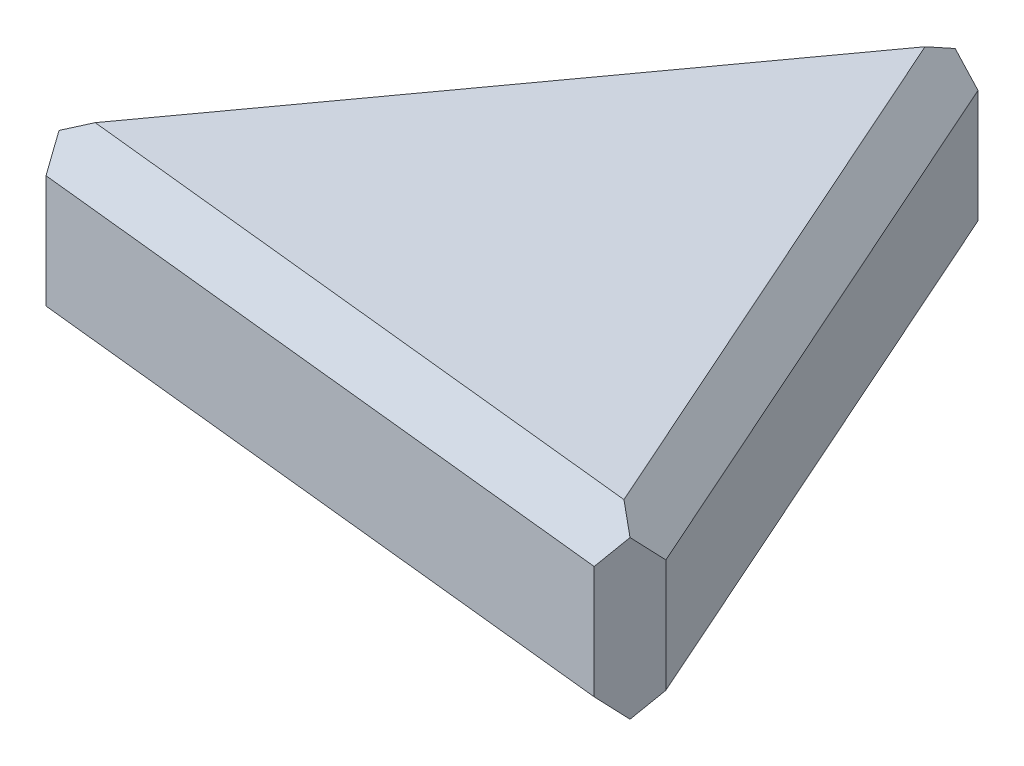
ISO-10303-21;
HEADER;
FILE_DESCRIPTION(('STEP AP214'),'2;1');
FILE_NAME('part.step','',(''),(''),'','','');
FILE_SCHEMA(('AUTOMOTIVE_DESIGN { 1 0 10303 214 1 1 1 1 }'));
ENDSEC;
DATA;
#1=APPLICATION_CONTEXT('core data for automotive mechanical design processes');
#2=APPLICATION_PROTOCOL_DEFINITION('international standard','automotive_design',2000,#1);
#3=PRODUCT_CONTEXT('',#1,'mechanical');
#4=PRODUCT('Part','Part','',(#3));
#5=PRODUCT_RELATED_PRODUCT_CATEGORY('part','',(#4));
#6=PRODUCT_DEFINITION_FORMATION('','',#4);
#7=PRODUCT_DEFINITION_CONTEXT('part definition',#1,'design');
#8=PRODUCT_DEFINITION('design','',#6,#7);
#9=PRODUCT_DEFINITION_SHAPE('','',#8);
#10=(LENGTH_UNIT() NAMED_UNIT(*) SI_UNIT(.MILLI.,.METRE.));
#11=(NAMED_UNIT(*) PLANE_ANGLE_UNIT() SI_UNIT($,.RADIAN.));
#12=(NAMED_UNIT(*) SI_UNIT($,.STERADIAN.) SOLID_ANGLE_UNIT());
#13=UNCERTAINTY_MEASURE_WITH_UNIT(LENGTH_MEASURE(1.E-05),#10,'distance_accuracy_value','');
#14=(GEOMETRIC_REPRESENTATION_CONTEXT(3) GLOBAL_UNCERTAINTY_ASSIGNED_CONTEXT((#13)) GLOBAL_UNIT_ASSIGNED_CONTEXT((#10,
#11,#12)) REPRESENTATION_CONTEXT('',''));
#15=CARTESIAN_POINT('',(0.,0.,0.));
#16=DIRECTION('',(0.,0.,1.));
#17=DIRECTION('',(1.,0.,0.));
#18=AXIS2_PLACEMENT_3D('',#15,#16,#17);
#19=CARTESIAN_POINT('',(-95.9799388681262,36.,20.608061996772));
#20=DIRECTION('',(0.104497998360099,0.,-0.99452509688732));
#21=DIRECTION('',(-0.99452509688732,0.,-0.104497998360099));
#22=AXIS2_PLACEMENT_3D('',#19,#20,#21);
#23=PLANE('',#22);
#24=DIRECTION('',(0.99452509688732,0.,0.104497998360099));
#25=VECTOR('',#24,1.);
#26=CARTESIAN_POINT('',(-95.9799388681262,6.99999999999998,20.608061996772));
#27=LINE('',#26,#25);
#28=CARTESIAN_POINT('',(-86.034687899253,6.99999999999998,21.653041980373));
#29=VERTEX_POINT('',#28);
#30=CARTESIAN_POINT('',(33.3083237272255,6.99999999999998,34.1928017835849));
#31=VERTEX_POINT('',#30);
#32=EDGE_CURVE('E158',#29,#31,#27,.T.);
#33=ORIENTED_EDGE('',*,*,#32,.T.);
#34=DIRECTION('',(0.,1.,0.));
#35=VECTOR('',#34,1.);
#36=CARTESIAN_POINT('',(33.3083237272255,36.,34.1928017835849));
#37=LINE('',#36,#35);
#38=CARTESIAN_POINT('',(33.3083237272255,29.,34.1928017835849));
#39=VERTEX_POINT('',#38);
#40=EDGE_CURVE('E197',#31,#39,#37,.T.);
#41=ORIENTED_EDGE('',*,*,#40,.T.);
#42=DIRECTION('',(-0.99452509688732,0.,-0.104497998360099));
#43=VECTOR('',#42,1.);
#44=CARTESIAN_POINT('',(-95.9799388681262,29.,20.608061996772));
#45=LINE('',#44,#43);
#46=CARTESIAN_POINT('',(-86.034687899253,29.,21.653041980373));
#47=VERTEX_POINT('',#46);
#48=EDGE_CURVE('E155',#39,#47,#45,.T.);
#49=ORIENTED_EDGE('',*,*,#48,.T.);
#50=DIRECTION('',(0.,-1.,0.));
#51=VECTOR('',#50,1.);
#52=CARTESIAN_POINT('',(-86.034687899253,36.,21.653041980373));
#53=LINE('',#52,#51);
#54=EDGE_CURVE('E194',#47,#29,#53,.T.);
#55=ORIENTED_EDGE('',*,*,#54,.T.);
#56=EDGE_LOOP('',(#33,#41,#49,#55));
#57=FACE_BOUND('',#56,.T.);
#58=ADVANCED_FACE('F34',(#57),#23,.F.);
#59=CARTESIAN_POINT('',(43.2535746960987,36.,35.2377817671859));
#60=DIRECTION('',(-0.913532997785649,0.,0.406764627219189));
#61=DIRECTION('',(0.406764627219189,0.,0.913532997785649));
#62=AXIS2_PLACEMENT_3D('',#59,#60,#61);
#63=PLANE('',#62);
#64=DIRECTION('',(0.406764627219189,0.,0.913532997785649));
#65=VECTOR('',#64,1.);
#66=CARTESIAN_POINT('',(43.2535746960987,29.,35.2377817671859));
#67=LINE('',#66,#65);
#68=CARTESIAN_POINT('',(-9.6258268423959,29.,-83.5215079449484));
#69=VERTEX_POINT('',#68);
#70=CARTESIAN_POINT('',(39.1859284239068,29.,26.1024517893295));
#71=VERTEX_POINT('',#70);
#72=EDGE_CURVE('E140',#69,#71,#67,.T.);
#73=ORIENTED_EDGE('',*,*,#72,.T.);
#74=DIRECTION('',(0.,-1.,0.));
#75=VECTOR('',#74,1.);
#76=CARTESIAN_POINT('',(39.1859284239068,36.,26.1024517893295));
#77=LINE('',#76,#75);
#78=CARTESIAN_POINT('',(39.1859284239068,6.99999999999999,26.1024517893295));
#79=VERTEX_POINT('',#78);
#80=EDGE_CURVE('E184',#71,#79,#77,.T.);
#81=ORIENTED_EDGE('',*,*,#80,.T.);
#82=DIRECTION('',(-0.406764627219189,0.,-0.913532997785649));
#83=VECTOR('',#82,1.);
#84=CARTESIAN_POINT('',(43.2535746960987,7.,35.2377817671859));
#85=LINE('',#84,#83);
#86=CARTESIAN_POINT('',(-9.62582684239593,7.,-83.5215079449485));
#87=VERTEX_POINT('',#86);
#88=EDGE_CURVE('E148',#79,#87,#85,.T.);
#89=ORIENTED_EDGE('',*,*,#88,.T.);
#90=DIRECTION('',(0.,1.,0.));
#91=VECTOR('',#90,1.);
#92=CARTESIAN_POINT('',(-9.6258268423959,36.,-83.5215079449484));
#93=LINE('',#92,#91);
#94=EDGE_CURVE('E173',#87,#69,#93,.T.);
#95=ORIENTED_EDGE('',*,*,#94,.T.);
#96=EDGE_LOOP('',(#73,#81,#89,#95));
#97=FACE_BOUND('',#96,.T.);
#98=ADVANCED_FACE('F241',(#97),#63,.F.);
#99=CARTESIAN_POINT('',(-13.6934731145878,36.,-92.6568379228049));
#100=DIRECTION('',(0.809034999425549,0.,0.587760469668131));
#101=DIRECTION('',(0.587760469668131,0.,-0.809034999425549));
#102=AXIS2_PLACEMENT_3D('',#99,#100,#101);
#103=PLANE('',#102);
#104=DIRECTION('',(0.587760469668131,0.,-0.809034999425549));
#105=VECTOR('',#104,1.);
#106=CARTESIAN_POINT('',(-13.6934731145878,29.,-92.6568379228049));
#107=LINE('',#106,#105);
#108=CARTESIAN_POINT('',(-90.1023341714449,29.,12.5177120025166));
#109=VERTEX_POINT('',#108);
#110=CARTESIAN_POINT('',(-19.5710778112691,29.,-84.5664879285494));
#111=VERTEX_POINT('',#110);
#112=EDGE_CURVE('E161',#109,#111,#107,.T.);
#113=ORIENTED_EDGE('',*,*,#112,.T.);
#114=DIRECTION('',(0.,-1.,0.));
#115=VECTOR('',#114,1.);
#116=CARTESIAN_POINT('',(-19.5710778112691,36.,-84.5664879285494));
#117=LINE('',#116,#115);
#118=CARTESIAN_POINT('',(-19.5710778112691,6.99999999999999,-84.5664879285494));
#119=VERTEX_POINT('',#118);
#120=EDGE_CURVE('E208',#111,#119,#117,.T.);
#121=ORIENTED_EDGE('',*,*,#120,.T.);
#122=DIRECTION('',(-0.587760469668131,0.,0.809034999425549));
#123=VECTOR('',#122,1.);
#124=CARTESIAN_POINT('',(-13.6934731145878,7.,-92.6568379228049));
#125=LINE('',#124,#123);
#126=CARTESIAN_POINT('',(-90.1023341714449,7.,12.5177120025166));
#127=VERTEX_POINT('',#126);
#128=EDGE_CURVE('E163',#119,#127,#125,.T.);
#129=ORIENTED_EDGE('',*,*,#128,.T.);
#130=DIRECTION('',(0.,1.,0.));
#131=VECTOR('',#130,1.);
#132=CARTESIAN_POINT('',(-90.1023341714449,36.,12.5177120025166));
#133=LINE('',#132,#131);
#134=EDGE_CURVE('E54',#127,#109,#133,.T.);
#135=ORIENTED_EDGE('',*,*,#134,.T.);
#136=EDGE_LOOP('',(#113,#121,#129,#135));
#137=FACE_BOUND('',#136,.T.);
#138=ADVANCED_FACE('F250',(#137),#103,.F.);
#139=CARTESIAN_POINT('',(0.,36.,0.));
#140=DIRECTION('',(0.,1.,0.));
#141=DIRECTION('',(0.,0.,1.));
#142=AXIS2_PLACEMENT_3D('',#139,#140,#141);
#143=PLANE('',#142);
#144=DIRECTION('',(-0.587760469668131,0.,0.809034999425549));
#145=VECTOR('',#144,1.);
#146=CARTESIAN_POINT('',(-90.3166938721473,36.,24.7223852844489));
#147=LINE('',#146,#145);
#148=CARTESIAN_POINT('',(-15.1564450916292,36.,-78.7334865663825));
#149=VERTEX_POINT('',#148);
#150=CARTESIAN_POINT('',(-83.1904768991271,36.,14.9133572157034));
#151=VERTEX_POINT('',#150);
#152=EDGE_CURVE('E165',#149,#151,#147,.T.);
#153=ORIENTED_EDGE('',*,*,#152,.T.);
#154=DIRECTION('',(0.99452509688732,0.,0.104497998360099));
#155=VECTOR('',#154,1.);
#156=CARTESIAN_POINT('',(43.9850606846194,36.,28.2761060889747));
#157=LINE('',#156,#155);
#158=CARTESIAN_POINT('',(31.927084704141,36.,27.0091351918321));
#159=VERTEX_POINT('',#158);
#160=EDGE_CURVE('E170',#151,#159,#157,.T.);
#161=ORIENTED_EDGE('',*,*,#160,.T.);
#162=DIRECTION('',(-0.406764627219189,0.,-0.913532997785649));
#163=VECTOR('',#162,1.);
#164=CARTESIAN_POINT('',(-20.0882040990873,36.,-89.8094855322706));
#165=LINE('',#164,#163);
#166=EDGE_CURVE('E167',#159,#149,#165,.T.);
#167=ORIENTED_EDGE('',*,*,#166,.T.);
#168=EDGE_LOOP('',(#153,#161,#167));
#169=FACE_BOUND('',#168,.T.);
#170=ADVANCED_FACE('F252',(#169),#143,.T.);
#171=CARTESIAN_POINT('',(0.,0.,0.));
#172=DIRECTION('',(0.,1.,0.));
#173=DIRECTION('',(0.,0.,1.));
#174=AXIS2_PLACEMENT_3D('',#171,#172,#173);
#175=PLANE('',#174);
#176=DIRECTION('',(0.587760469668131,0.,-0.809034999425549));
#177=VECTOR('',#176,1.);
#178=CARTESIAN_POINT('',(-47.3597160161607,0.,-34.4066312937918));
#179=LINE('',#178,#177);
#180=CARTESIAN_POINT('',(-83.1904768991271,0.,14.9133572157034));
#181=VERTEX_POINT('',#180);
#182=CARTESIAN_POINT('',(-15.1564450916292,0.,-78.7334865663824));
#183=VERTEX_POINT('',#182);
#184=EDGE_CURVE('E127',#181,#183,#179,.T.);
#185=ORIENTED_EDGE('',*,*,#184,.T.);
#186=DIRECTION('',(0.406764627219189,0.,0.913532997785649));
#187=VECTOR('',#186,1.);
#188=CARTESIAN_POINT('',(16.6081071777941,0.,-7.39501533208645));
#189=LINE('',#188,#187);
#190=CARTESIAN_POINT('',(31.9270847041409,0.,27.0091351918321));
#191=VERTEX_POINT('',#190);
#192=EDGE_CURVE('E129',#183,#191,#189,.T.);
#193=ORIENTED_EDGE('',*,*,#192,.T.);
#194=DIRECTION('',(-0.99452509688732,0.,-0.104497998360099));
#195=VECTOR('',#194,1.);
#196=CARTESIAN_POINT('',(-2.45830980494107,0.,23.3961495464547));
#197=LINE('',#196,#195);
#198=EDGE_CURVE('E123',#191,#181,#197,.T.);
#199=ORIENTED_EDGE('',*,*,#198,.T.);
#200=EDGE_LOOP('',(#185,#193,#199));
#201=FACE_BOUND('',#200,.T.);
#202=ADVANCED_FACE('F125',(#201),#175,.F.);
#203=CARTESIAN_POINT('',(-95.9799388681262,6.99999999999998,20.608061996772));
#204=DIRECTION('',(0.0738912432608467,0.70710678118655,-0.70323544006923));
#205=DIRECTION('',(0.99452509688732,0.,0.104497998360099));
#206=AXIS2_PLACEMENT_3D('',#203,#204,#205);
#207=PLANE('',#206);
#208=DIRECTION('',(0.723622901956814,0.447213595499956,0.525708945866058));
#209=VECTOR('',#208,1.);
#210=CARTESIAN_POINT('',(-35.2186498538661,-41.4974226119285,-21.7719540169761));
#211=LINE('',#210,#209);
#212=CARTESIAN_POINT('',(36.2471260755661,2.66987298107779,30.1476267864572));
#213=VERTEX_POINT('',#212);
#214=EDGE_CURVE('E141',#213,#191,#211,.F.);
#215=ORIENTED_EDGE('',*,*,#214,.F.);
#216=DIRECTION('',(-0.444305152347543,0.654653670707975,0.611572974407798));
#217=VECTOR('',#216,1.);
#218=CARTESIAN_POINT('',(11.4772205681234,39.1666578548506,64.2426731908198));
#219=LINE('',#218,#217);
#220=EDGE_CURVE('E192',#213,#31,#219,.T.);
#221=ORIENTED_EDGE('',*,*,#220,.T.);
#222=ORIENTED_EDGE('',*,*,#32,.F.);
#223=DIRECTION('',(-0.307485155931391,-0.654653670707975,-0.690566036169186));
#224=VECTOR('',#223,1.);
#225=CARTESIAN_POINT('',(-87.1968725484507,4.52564170347303,19.0429477009854));
#226=LINE('',#225,#224);
#227=CARTESIAN_POINT('',(-88.068511035349,2.66987298107783,17.0853769914448));
#228=VERTEX_POINT('',#227);
#229=EDGE_CURVE('E137',#29,#228,#226,.T.);
#230=ORIENTED_EDGE('',*,*,#229,.T.);
#231=DIRECTION('',(-0.817088753095151,0.447213595499956,0.363821342921788));
#232=VECTOR('',#231,1.);
#233=CARTESIAN_POINT('',(-7.37194714102068,-41.4974226119285,-18.8460100628933));
#234=LINE('',#233,#232);
#235=EDGE_CURVE('E134',#181,#228,#234,.T.);
#236=ORIENTED_EDGE('',*,*,#235,.F.);
#237=ORIENTED_EDGE('',*,*,#198,.F.);
#238=EDGE_LOOP('',(#215,#221,#222,#230,#236,#237));
#239=FACE_BOUND('',#238,.T.);
#240=ADVANCED_FACE('F135',(#239),#207,.F.);
#241=CARTESIAN_POINT('',(-13.6934731145878,6.99999999999998,-92.6568379228049));
#242=DIRECTION('',(0.572074134311059,0.707106781186549,0.415609413815725));
#243=DIRECTION('',(-0.587760469668131,0.,0.809034999425549));
#244=AXIS2_PLACEMENT_3D('',#241,#242,#243);
#245=PLANE('',#244);
#246=ORIENTED_EDGE('',*,*,#128,.F.);
#247=DIRECTION('',(0.751790308278934,-0.654653670707976,0.0789930617613894));
#248=VECTOR('',#247,1.);
#249=CARTESIAN_POINT('',(-16.7295775344482,4.52564170347302,-84.2679222189492));
#250=LINE('',#249,#248);
#251=CARTESIAN_POINT('',(-14.5984523268325,2.66987298107781,-84.0439979367489));
#252=VERTEX_POINT('',#251);
#253=EDGE_CURVE('E213',#119,#252,#250,.T.);
#254=ORIENTED_EDGE('',*,*,#253,.T.);
#255=DIRECTION('',(-0.0934658511383387,-0.447213595499956,0.889530288787845));
#256=VECTOR('',#255,1.);
#257=CARTESIAN_POINT('',(-13.6934731145878,6.99999999999998,-92.6568379228049));
#258=LINE('',#257,#256);
#259=EDGE_CURVE('E147',#183,#252,#258,.F.);
#260=ORIENTED_EDGE('',*,*,#259,.F.);
#261=ORIENTED_EDGE('',*,*,#184,.F.);
#262=ORIENTED_EDGE('',*,*,#235,.T.);
#263=DIRECTION('',(-0.307485155931391,0.654653670707976,-0.690566036169186));
#264=VECTOR('',#263,1.);
#265=CARTESIAN_POINT('',(-105.210734611015,39.1666578548506,-21.413513629522));
#266=LINE('',#265,#264);
#267=EDGE_CURVE('E211',#228,#127,#266,.T.);
#268=ORIENTED_EDGE('',*,*,#267,.T.);
#269=EDGE_LOOP('',(#246,#254,#260,#261,#262,#268));
#270=FACE_BOUND('',#269,.T.);
#271=ADVANCED_FACE('F145',(#270),#245,.F.);
#272=CARTESIAN_POINT('',(43.2535746960987,6.99999999999998,35.2377817671859));
#273=DIRECTION('',(-0.645965377571906,0.70710678118655,0.287626026253506));
#274=DIRECTION('',(-0.406764627219189,0.,-0.913532997785649));
#275=AXIS2_PLACEMENT_3D('',#272,#273,#274);
#276=PLANE('',#275);
#277=ORIENTED_EDGE('',*,*,#88,.F.);
#278=DIRECTION('',(-0.444305152347543,-0.654653670707975,0.611572974407798));
#279=VECTOR('',#278,1.);
#280=CARTESIAN_POINT('',(37.5066127962835,4.52564170347302,28.4139803591168));
#281=LINE('',#280,#279);
#282=EDGE_CURVE('E189',#79,#213,#281,.T.);
#283=ORIENTED_EDGE('',*,*,#282,.T.);
#284=ORIENTED_EDGE('',*,*,#214,.T.);
#285=ORIENTED_EDGE('',*,*,#192,.F.);
#286=ORIENTED_EDGE('',*,*,#259,.T.);
#287=DIRECTION('',(0.751790308278935,0.654653670707975,0.0789930617613895));
#288=VECTOR('',#287,1.);
#289=CARTESIAN_POINT('',(27.3136767562763,39.1666578548506,-79.6401537201446));
#290=LINE('',#289,#288);
#291=EDGE_CURVE('E187',#252,#87,#290,.T.);
#292=ORIENTED_EDGE('',*,*,#291,.T.);
#293=EDGE_LOOP('',(#277,#283,#284,#285,#286,#292));
#294=FACE_BOUND('',#293,.T.);
#295=ADVANCED_FACE('F244',(#294),#276,.F.);
#296=CARTESIAN_POINT('',(-47.3597160161607,36.,-34.4066312937918));
#297=DIRECTION('',(-0.572074134311062,0.707106781186545,-0.415609413815727));
#298=DIRECTION('',(0.587760469668131,0.,-0.809034999425549));
#299=AXIS2_PLACEMENT_3D('',#296,#297,#298);
#300=PLANE('',#299);
#301=DIRECTION('',(0.0934658511383386,-0.44721359549996,-0.889530288787843));
#302=VECTOR('',#301,1.);
#303=CARTESIAN_POINT('',(-19.1231345519722,54.9797389547781,-40.9818331205893));
#304=LINE('',#303,#302);
#305=CARTESIAN_POINT('',(-14.5984523268325,33.3301270189222,-84.0439979367489));
#306=VERTEX_POINT('',#305);
#307=EDGE_CURVE('E175',#306,#149,#304,.F.);
#308=ORIENTED_EDGE('',*,*,#307,.F.);
#309=DIRECTION('',(0.75179030827893,0.65465367070798,0.078993061761389));
#310=VECTOR('',#309,1.);
#311=CARTESIAN_POINT('',(-28.8529610252272,20.917401900257,-85.5417656967089));
#312=LINE('',#311,#310);
#313=EDGE_CURVE('E11',#306,#111,#312,.F.);
#314=ORIENTED_EDGE('',*,*,#313,.T.);
#315=ORIENTED_EDGE('',*,*,#112,.F.);
#316=DIRECTION('',(-0.307485155931389,-0.65465367070798,-0.690566036169183));
#317=VECTOR('',#316,1.);
#318=CARTESIAN_POINT('',(-94.6159276692866,19.3902985414193,2.3808507246373));
#319=LINE('',#318,#317);
#320=CARTESIAN_POINT('',(-88.068511035349,33.3301270189222,17.0853769914448));
#321=VERTEX_POINT('',#320);
#322=EDGE_CURVE('E42',#109,#321,#319,.F.);
#323=ORIENTED_EDGE('',*,*,#322,.T.);
#324=DIRECTION('',(0.817088753095149,0.44721359549996,-0.363821342921787));
#325=VECTOR('',#324,1.);
#326=CARTESIAN_POINT('',(-44.6070751839156,57.1176836571507,-2.26649622536387));
#327=LINE('',#326,#325);
#328=EDGE_CURVE('E179',#151,#321,#327,.F.);
#329=ORIENTED_EDGE('',*,*,#328,.F.);
#330=ORIENTED_EDGE('',*,*,#152,.F.);
#331=EDGE_LOOP('',(#308,#314,#315,#323,#329,#330));
#332=FACE_BOUND('',#331,.T.);
#333=ADVANCED_FACE('F216',(#332),#300,.T.);
#334=CARTESIAN_POINT('',(16.6081071777942,36.,-7.39501533208645));
#335=DIRECTION('',(0.645965377571909,0.707106781186546,-0.287626026253507));
#336=DIRECTION('',(0.406764627219189,0.,0.913532997785649));
#337=AXIS2_PLACEMENT_3D('',#334,#335,#336);
#338=PLANE('',#337);
#339=DIRECTION('',(0.723622901956812,-0.44721359549996,0.525708945866057));
#340=VECTOR('',#339,1.);
#341=CARTESIAN_POINT('',(10.817750848598,49.0459954578798,11.6732943566087));
#342=LINE('',#341,#340);
#343=CARTESIAN_POINT('',(36.2471260755661,33.3301270189222,30.1476267864572));
#344=VERTEX_POINT('',#343);
#345=EDGE_CURVE('E177',#344,#159,#342,.F.);
#346=ORIENTED_EDGE('',*,*,#345,.F.);
#347=DIRECTION('',(-0.444305152347541,0.654653670707979,0.611572974407795));
#348=VECTOR('',#347,1.);
#349=CARTESIAN_POINT('',(41.7949449714674,25.1557901123271,22.5112172473931));
#350=LINE('',#349,#348);
#351=EDGE_CURVE('E205',#344,#71,#350,.F.);
#352=ORIENTED_EDGE('',*,*,#351,.T.);
#353=ORIENTED_EDGE('',*,*,#72,.F.);
#354=DIRECTION('',(0.751790308278932,-0.654653670707978,0.0789930617613891));
#355=VECTOR('',#354,1.);
#356=CARTESIAN_POINT('',(6.27702388372003,15.1519103293492,-81.8505435074498));
#357=LINE('',#356,#355);
#358=EDGE_CURVE('E203',#69,#306,#357,.F.);
#359=ORIENTED_EDGE('',*,*,#358,.T.);
#360=ORIENTED_EDGE('',*,*,#307,.T.);
#361=ORIENTED_EDGE('',*,*,#166,.F.);
#362=EDGE_LOOP('',(#346,#352,#353,#359,#360,#361));
#363=FACE_BOUND('',#362,.T.);
#364=ADVANCED_FACE('F236',(#363),#338,.T.);
#365=CARTESIAN_POINT('',(-2.45830980494107,36.,23.3961495464547));
#366=DIRECTION('',(-0.0738912432608472,0.707106781186546,0.703235440069234));
#367=DIRECTION('',(-0.99452509688732,0.,-0.104497998360099));
#368=AXIS2_PLACEMENT_3D('',#365,#366,#367);
#369=PLANE('',#368);
#370=ORIENTED_EDGE('',*,*,#48,.F.);
#371=DIRECTION('',(-0.444305152347541,-0.654653670707979,0.611572974407795));
#372=VECTOR('',#371,1.);
#373=CARTESIAN_POINT('',(31.2175200308699,25.9193417917459,37.0707315773921));
#374=LINE('',#373,#372);
#375=EDGE_CURVE('E201',#39,#344,#374,.F.);
#376=ORIENTED_EDGE('',*,*,#375,.T.);
#377=ORIENTED_EDGE('',*,*,#345,.T.);
#378=ORIENTED_EDGE('',*,*,#160,.F.);
#379=ORIENTED_EDGE('',*,*,#328,.T.);
#380=DIRECTION('',(-0.307485155931389,0.65465367070798,-0.690566036169183));
#381=VECTOR('',#380,1.);
#382=CARTESIAN_POINT('',(-79.1717265809718,14.3883586499305,37.0662347883061));
#383=LINE('',#382,#381);
#384=EDGE_CURVE('E199',#321,#47,#383,.F.);
#385=ORIENTED_EDGE('',*,*,#384,.T.);
#386=EDGE_LOOP('',(#370,#376,#377,#378,#379,#385));
#387=FACE_BOUND('',#386,.T.);
#388=ADVANCED_FACE('F223',(#387),#369,.T.);
#389=CARTESIAN_POINT('',(39.1859284239068,36.,26.1024517893295));
#390=DIRECTION('',(-0.809034999425549,0.,-0.587760469668131));
#391=DIRECTION('',(0.,-1.,0.));
#392=AXIS2_PLACEMENT_3D('',#389,#390,#391);
#393=PLANE('',#392);
#394=ORIENTED_EDGE('',*,*,#375,.F.);
#395=ORIENTED_EDGE('',*,*,#40,.F.);
#396=ORIENTED_EDGE('',*,*,#220,.F.);
#397=ORIENTED_EDGE('',*,*,#282,.F.);
#398=ORIENTED_EDGE('',*,*,#80,.F.);
#399=ORIENTED_EDGE('',*,*,#351,.F.);
#400=EDGE_LOOP('',(#394,#395,#396,#397,#398,#399));
#401=FACE_BOUND('',#400,.T.);
#402=ADVANCED_FACE('F230',(#401),#393,.F.);
#403=CARTESIAN_POINT('',(-19.5710778112691,36.,-84.5664879285494));
#404=DIRECTION('',(-0.104497998360101,0.,0.99452509688732));
#405=DIRECTION('',(0.,-1.,0.));
#406=AXIS2_PLACEMENT_3D('',#403,#404,#405);
#407=PLANE('',#406);
#408=ORIENTED_EDGE('',*,*,#358,.F.);
#409=ORIENTED_EDGE('',*,*,#94,.F.);
#410=ORIENTED_EDGE('',*,*,#291,.F.);
#411=ORIENTED_EDGE('',*,*,#253,.F.);
#412=ORIENTED_EDGE('',*,*,#120,.F.);
#413=ORIENTED_EDGE('',*,*,#313,.F.);
#414=EDGE_LOOP('',(#408,#409,#410,#411,#412,#413));
#415=FACE_BOUND('',#414,.T.);
#416=ADVANCED_FACE('F248',(#415),#407,.F.);
#417=CARTESIAN_POINT('',(-86.034687899253,36.,21.653041980373));
#418=DIRECTION('',(0.913532997785649,0.,-0.406764627219188));
#419=DIRECTION('',(0.,-1.,0.));
#420=AXIS2_PLACEMENT_3D('',#417,#418,#419);
#421=PLANE('',#420);
#422=ORIENTED_EDGE('',*,*,#322,.F.);
#423=ORIENTED_EDGE('',*,*,#134,.F.);
#424=ORIENTED_EDGE('',*,*,#267,.F.);
#425=ORIENTED_EDGE('',*,*,#229,.F.);
#426=ORIENTED_EDGE('',*,*,#54,.F.);
#427=ORIENTED_EDGE('',*,*,#384,.F.);
#428=EDGE_LOOP('',(#422,#423,#424,#425,#426,#427));
#429=FACE_BOUND('',#428,.T.);
#430=ADVANCED_FACE('F36',(#429),#421,.F.);
#431=CLOSED_SHELL('',(#58,#98,#138,#170,#202,#240,#271,#295,#333,#364,#388,#402,#416,#430));
#432=MANIFOLD_SOLID_BREP('B2',#431);
#433=ADVANCED_BREP_SHAPE_REPRESENTATION('',(#18,#432),#14);
#434=SHAPE_DEFINITION_REPRESENTATION(#9,#433);
ENDSEC;
END-ISO-10303-21;
